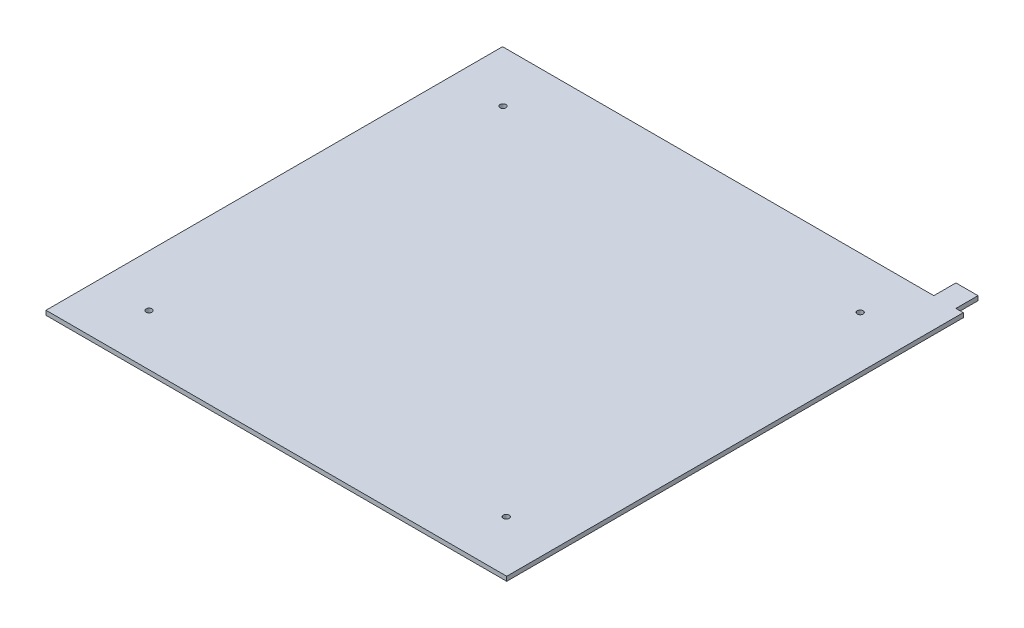
ISO-10303-21;
HEADER;
FILE_DESCRIPTION(('STEP AP214'),'2;1');
FILE_NAME('part.step','',(''),(''),'','','');
FILE_SCHEMA(('AUTOMOTIVE_DESIGN { 1 0 10303 214 1 1 1 1 }'));
ENDSEC;
DATA;
#1=APPLICATION_CONTEXT('core data for automotive mechanical design processes');
#2=APPLICATION_PROTOCOL_DEFINITION('international standard','automotive_design',2000,#1);
#3=PRODUCT_CONTEXT('',#1,'mechanical');
#4=PRODUCT('Part','Part','',(#3));
#5=PRODUCT_RELATED_PRODUCT_CATEGORY('part','',(#4));
#6=PRODUCT_DEFINITION_FORMATION('','',#4);
#7=PRODUCT_DEFINITION_CONTEXT('part definition',#1,'design');
#8=PRODUCT_DEFINITION('design','',#6,#7);
#9=PRODUCT_DEFINITION_SHAPE('','',#8);
#10=(LENGTH_UNIT() NAMED_UNIT(*) SI_UNIT(.MILLI.,.METRE.));
#11=(NAMED_UNIT(*) PLANE_ANGLE_UNIT() SI_UNIT($,.RADIAN.));
#12=(NAMED_UNIT(*) SI_UNIT($,.STERADIAN.) SOLID_ANGLE_UNIT());
#13=UNCERTAINTY_MEASURE_WITH_UNIT(LENGTH_MEASURE(1.E-05),#10,'distance_accuracy_value','');
#14=(GEOMETRIC_REPRESENTATION_CONTEXT(3) GLOBAL_UNCERTAINTY_ASSIGNED_CONTEXT((#13)) GLOBAL_UNIT_ASSIGNED_CONTEXT((#10,
#11,#12)) REPRESENTATION_CONTEXT('',''));
#15=CARTESIAN_POINT('',(0.,0.,0.));
#16=DIRECTION('',(0.,0.,1.));
#17=DIRECTION('',(1.,0.,0.));
#18=AXIS2_PLACEMENT_3D('',#15,#16,#17);
#19=CARTESIAN_POINT('',(0.,3.,0.));
#20=DIRECTION('',(0.,1.,0.));
#21=DIRECTION('',(0.,0.,1.));
#22=AXIS2_PLACEMENT_3D('',#19,#20,#21);
#23=PLANE('',#22);
#24=CARTESIAN_POINT('',(121.256330779657,3.,120.159391815663));
#25=DIRECTION('',(0.,1.,0.));
#26=DIRECTION('',(0.,0.,1.));
#27=AXIS2_PLACEMENT_3D('',#24,#25,#26);
#28=CIRCLE('',#27,2.);
#29=CARTESIAN_POINT('',(121.256330779657,3.,122.159391815663));
#30=VERTEX_POINT('',#29);
#31=EDGE_CURVE('E200',#30,#30,#28,.T.);
#32=ORIENTED_EDGE('',*,*,#31,.F.);
#33=EDGE_LOOP('',(#32));
#34=FACE_BOUND('',#33,.T.);
#35=CARTESIAN_POINT('',(-121.256330779657,3.,-120.159391815663));
#36=DIRECTION('',(0.,1.,0.));
#37=DIRECTION('',(0.,0.,1.));
#38=AXIS2_PLACEMENT_3D('',#35,#36,#37);
#39=CIRCLE('',#38,2.);
#40=CARTESIAN_POINT('',(-121.256330779657,3.,-118.159391815663));
#41=VERTEX_POINT('',#40);
#42=EDGE_CURVE('E146',#41,#41,#39,.T.);
#43=ORIENTED_EDGE('',*,*,#42,.F.);
#44=EDGE_LOOP('',(#43));
#45=FACE_BOUND('',#44,.T.);
#46=DIRECTION('',(-1.,0.,0.));
#47=VECTOR('',#46,1.);
#48=CARTESIAN_POINT('',(151.415,3.,-155.));
#49=LINE('',#48,#47);
#50=CARTESIAN_POINT('',(156.415,3.,-155.));
#51=VERTEX_POINT('',#50);
#52=CARTESIAN_POINT('',(151.415,3.,-155.));
#53=VERTEX_POINT('',#52);
#54=EDGE_CURVE('E157',#51,#53,#49,.T.);
#55=ORIENTED_EDGE('',*,*,#54,.T.);
#56=DIRECTION('',(0.,0.,-1.));
#57=VECTOR('',#56,1.);
#58=CARTESIAN_POINT('',(151.415,3.,-155.));
#59=LINE('',#58,#57);
#60=CARTESIAN_POINT('',(151.415,3.,-170.));
#61=VERTEX_POINT('',#60);
#62=EDGE_CURVE('E105',#53,#61,#59,.T.);
#63=ORIENTED_EDGE('',*,*,#62,.T.);
#64=DIRECTION('',(-1.,0.,0.));
#65=VECTOR('',#64,1.);
#66=CARTESIAN_POINT('',(151.415,3.,-170.));
#67=LINE('',#66,#65);
#68=CARTESIAN_POINT('',(136.415,3.,-170.));
#69=VERTEX_POINT('',#68);
#70=EDGE_CURVE('E172',#61,#69,#67,.T.);
#71=ORIENTED_EDGE('',*,*,#70,.T.);
#72=DIRECTION('',(0.,0.,1.));
#73=VECTOR('',#72,1.);
#74=CARTESIAN_POINT('',(136.415,3.,-170.));
#75=LINE('',#74,#73);
#76=CARTESIAN_POINT('',(136.415,3.,-155.));
#77=VERTEX_POINT('',#76);
#78=EDGE_CURVE('E185',#69,#77,#75,.T.);
#79=ORIENTED_EDGE('',*,*,#78,.T.);
#80=DIRECTION('',(-1.,0.,0.));
#81=VECTOR('',#80,1.);
#82=CARTESIAN_POINT('',(-156.415,3.,-155.));
#83=LINE('',#82,#81);
#84=CARTESIAN_POINT('',(-156.415,3.,-155.));
#85=VERTEX_POINT('',#84);
#86=EDGE_CURVE('E124',#77,#85,#83,.T.);
#87=ORIENTED_EDGE('',*,*,#86,.T.);
#88=DIRECTION('',(0.,0.,1.));
#89=VECTOR('',#88,1.);
#90=CARTESIAN_POINT('',(-156.415,3.,155.));
#91=LINE('',#90,#89);
#92=CARTESIAN_POINT('',(-156.415,3.,155.));
#93=VERTEX_POINT('',#92);
#94=EDGE_CURVE('E118',#85,#93,#91,.T.);
#95=ORIENTED_EDGE('',*,*,#94,.T.);
#96=DIRECTION('',(1.,0.,0.));
#97=VECTOR('',#96,1.);
#98=CARTESIAN_POINT('',(-156.415,3.,155.));
#99=LINE('',#98,#97);
#100=CARTESIAN_POINT('',(156.415,3.,155.));
#101=VERTEX_POINT('',#100);
#102=EDGE_CURVE('E122',#93,#101,#99,.T.);
#103=ORIENTED_EDGE('',*,*,#102,.T.);
#104=DIRECTION('',(0.,0.,-1.));
#105=VECTOR('',#104,1.);
#106=CARTESIAN_POINT('',(156.415,3.,155.));
#107=LINE('',#106,#105);
#108=EDGE_CURVE('E62',#101,#51,#107,.T.);
#109=ORIENTED_EDGE('',*,*,#108,.T.);
#110=EDGE_LOOP('',(#55,#63,#71,#79,#87,#95,#103,#109));
#111=FACE_BOUND('',#110,.T.);
#112=CARTESIAN_POINT('',(-121.256330779657,3.,120.159391815663));
#113=DIRECTION('',(0.,1.,0.));
#114=DIRECTION('',(0.,0.,-1.));
#115=AXIS2_PLACEMENT_3D('',#112,#113,#114);
#116=CIRCLE('',#115,2.);
#117=CARTESIAN_POINT('',(-121.256330779657,3.,118.159391815663));
#118=VERTEX_POINT('',#117);
#119=EDGE_CURVE('E194',#118,#118,#116,.T.);
#120=ORIENTED_EDGE('',*,*,#119,.F.);
#121=EDGE_LOOP('',(#120));
#122=FACE_BOUND('',#121,.T.);
#123=CARTESIAN_POINT('',(121.256330779657,3.,-120.159391815663));
#124=DIRECTION('',(0.,1.,0.));
#125=DIRECTION('',(0.,0.,-1.));
#126=AXIS2_PLACEMENT_3D('',#123,#124,#125);
#127=CIRCLE('',#126,2.);
#128=CARTESIAN_POINT('',(121.256330779657,3.,-122.159391815663));
#129=VERTEX_POINT('',#128);
#130=EDGE_CURVE('E206',#129,#129,#127,.T.);
#131=ORIENTED_EDGE('',*,*,#130,.F.);
#132=EDGE_LOOP('',(#131));
#133=FACE_BOUND('',#132,.T.);
#134=ADVANCED_FACE('F45',(#34,#45,#111,#122,#133),#23,.T.);
#135=CARTESIAN_POINT('',(0.,0.,0.));
#136=DIRECTION('',(0.,1.,0.));
#137=DIRECTION('',(0.,0.,1.));
#138=AXIS2_PLACEMENT_3D('',#135,#136,#137);
#139=PLANE('',#138);
#140=DIRECTION('',(-1.,0.,0.));
#141=VECTOR('',#140,1.);
#142=CARTESIAN_POINT('',(151.415,0.,-155.));
#143=LINE('',#142,#141);
#144=CARTESIAN_POINT('',(156.415,0.,-155.));
#145=VERTEX_POINT('',#144);
#146=CARTESIAN_POINT('',(151.415,0.,-155.));
#147=VERTEX_POINT('',#146);
#148=EDGE_CURVE('E142',#145,#147,#143,.T.);
#149=ORIENTED_EDGE('',*,*,#148,.F.);
#150=DIRECTION('',(0.,0.,-1.));
#151=VECTOR('',#150,1.);
#152=CARTESIAN_POINT('',(156.415,0.,155.));
#153=LINE('',#152,#151);
#154=CARTESIAN_POINT('',(156.415,0.,155.));
#155=VERTEX_POINT('',#154);
#156=EDGE_CURVE('E97',#155,#145,#153,.T.);
#157=ORIENTED_EDGE('',*,*,#156,.F.);
#158=DIRECTION('',(1.,0.,0.));
#159=VECTOR('',#158,1.);
#160=CARTESIAN_POINT('',(-156.415,0.,155.));
#161=LINE('',#160,#159);
#162=CARTESIAN_POINT('',(-156.415,0.,155.));
#163=VERTEX_POINT('',#162);
#164=EDGE_CURVE('E91',#163,#155,#161,.T.);
#165=ORIENTED_EDGE('',*,*,#164,.F.);
#166=DIRECTION('',(0.,0.,1.));
#167=VECTOR('',#166,1.);
#168=CARTESIAN_POINT('',(-156.415,0.,155.));
#169=LINE('',#168,#167);
#170=CARTESIAN_POINT('',(-156.415,0.,-155.));
#171=VERTEX_POINT('',#170);
#172=EDGE_CURVE('E132',#171,#163,#169,.T.);
#173=ORIENTED_EDGE('',*,*,#172,.F.);
#174=DIRECTION('',(-1.,0.,0.));
#175=VECTOR('',#174,1.);
#176=CARTESIAN_POINT('',(-156.415,0.,-155.));
#177=LINE('',#176,#175);
#178=CARTESIAN_POINT('',(136.415,0.,-155.));
#179=VERTEX_POINT('',#178);
#180=EDGE_CURVE('E152',#179,#171,#177,.T.);
#181=ORIENTED_EDGE('',*,*,#180,.F.);
#182=DIRECTION('',(0.,0.,1.));
#183=VECTOR('',#182,1.);
#184=CARTESIAN_POINT('',(136.415,0.,-170.));
#185=LINE('',#184,#183);
#186=CARTESIAN_POINT('',(136.415,0.,-170.));
#187=VERTEX_POINT('',#186);
#188=EDGE_CURVE('E150',#187,#179,#185,.T.);
#189=ORIENTED_EDGE('',*,*,#188,.F.);
#190=DIRECTION('',(-1.,0.,0.));
#191=VECTOR('',#190,1.);
#192=CARTESIAN_POINT('',(151.415,0.,-170.));
#193=LINE('',#192,#191);
#194=CARTESIAN_POINT('',(151.415,0.,-170.));
#195=VERTEX_POINT('',#194);
#196=EDGE_CURVE('E148',#195,#187,#193,.T.);
#197=ORIENTED_EDGE('',*,*,#196,.F.);
#198=DIRECTION('',(0.,0.,-1.));
#199=VECTOR('',#198,1.);
#200=CARTESIAN_POINT('',(151.415,0.,-155.));
#201=LINE('',#200,#199);
#202=EDGE_CURVE('E145',#147,#195,#201,.T.);
#203=ORIENTED_EDGE('',*,*,#202,.F.);
#204=EDGE_LOOP('',(#149,#157,#165,#173,#181,#189,#197,#203));
#205=FACE_BOUND('',#204,.T.);
#206=CARTESIAN_POINT('',(-121.256330779657,0.,-120.159391815663));
#207=DIRECTION('',(0.,1.,0.));
#208=DIRECTION('',(0.,0.,1.));
#209=AXIS2_PLACEMENT_3D('',#206,#207,#208);
#210=CIRCLE('',#209,2.);
#211=CARTESIAN_POINT('',(-121.256330779657,0.,-118.159391815663));
#212=VERTEX_POINT('',#211);
#213=EDGE_CURVE('E191',#212,#212,#210,.T.);
#214=ORIENTED_EDGE('',*,*,#213,.T.);
#215=EDGE_LOOP('',(#214));
#216=FACE_BOUND('',#215,.T.);
#217=CARTESIAN_POINT('',(-121.256330779657,0.,120.159391815663));
#218=DIRECTION('',(0.,1.,0.));
#219=DIRECTION('',(0.,0.,-1.));
#220=AXIS2_PLACEMENT_3D('',#217,#218,#219);
#221=CIRCLE('',#220,2.);
#222=CARTESIAN_POINT('',(-121.256330779657,0.,118.159391815663));
#223=VERTEX_POINT('',#222);
#224=EDGE_CURVE('E197',#223,#223,#221,.T.);
#225=ORIENTED_EDGE('',*,*,#224,.T.);
#226=EDGE_LOOP('',(#225));
#227=FACE_BOUND('',#226,.T.);
#228=CARTESIAN_POINT('',(121.256330779657,0.,120.159391815663));
#229=DIRECTION('',(0.,1.,0.));
#230=DIRECTION('',(0.,0.,1.));
#231=AXIS2_PLACEMENT_3D('',#228,#229,#230);
#232=CIRCLE('',#231,2.);
#233=CARTESIAN_POINT('',(121.256330779657,0.,122.159391815663));
#234=VERTEX_POINT('',#233);
#235=EDGE_CURVE('E203',#234,#234,#232,.T.);
#236=ORIENTED_EDGE('',*,*,#235,.T.);
#237=EDGE_LOOP('',(#236));
#238=FACE_BOUND('',#237,.T.);
#239=CARTESIAN_POINT('',(121.256330779657,0.,-120.159391815663));
#240=DIRECTION('',(0.,1.,0.));
#241=DIRECTION('',(0.,0.,-1.));
#242=AXIS2_PLACEMENT_3D('',#239,#240,#241);
#243=CIRCLE('',#242,2.);
#244=CARTESIAN_POINT('',(121.256330779657,0.,-122.159391815663));
#245=VERTEX_POINT('',#244);
#246=EDGE_CURVE('E209',#245,#245,#243,.T.);
#247=ORIENTED_EDGE('',*,*,#246,.T.);
#248=EDGE_LOOP('',(#247));
#249=FACE_BOUND('',#248,.T.);
#250=ADVANCED_FACE('F176',(#205,#216,#227,#238,#249),#139,.F.);
#251=CARTESIAN_POINT('',(151.415,3.,-155.));
#252=DIRECTION('',(0.,0.,1.));
#253=DIRECTION('',(1.,0.,0.));
#254=AXIS2_PLACEMENT_3D('',#251,#252,#253);
#255=PLANE('',#254);
#256=ORIENTED_EDGE('',*,*,#148,.T.);
#257=DIRECTION('',(0.,-1.,0.));
#258=VECTOR('',#257,1.);
#259=CARTESIAN_POINT('',(151.415,3.,-155.));
#260=LINE('',#259,#258);
#261=EDGE_CURVE('E11',#53,#147,#260,.T.);
#262=ORIENTED_EDGE('',*,*,#261,.F.);
#263=ORIENTED_EDGE('',*,*,#54,.F.);
#264=DIRECTION('',(0.,-1.,0.));
#265=VECTOR('',#264,1.);
#266=CARTESIAN_POINT('',(156.415,3.,-155.));
#267=LINE('',#266,#265);
#268=EDGE_CURVE('E138',#51,#145,#267,.T.);
#269=ORIENTED_EDGE('',*,*,#268,.T.);
#270=EDGE_LOOP('',(#256,#262,#263,#269));
#271=FACE_BOUND('',#270,.T.);
#272=ADVANCED_FACE('F47',(#271),#255,.F.);
#273=CARTESIAN_POINT('',(151.415,3.,-155.));
#274=DIRECTION('',(-1.,0.,0.));
#275=DIRECTION('',(0.,0.,1.));
#276=AXIS2_PLACEMENT_3D('',#273,#274,#275);
#277=PLANE('',#276);
#278=ORIENTED_EDGE('',*,*,#202,.T.);
#279=DIRECTION('',(0.,-1.,0.));
#280=VECTOR('',#279,1.);
#281=CARTESIAN_POINT('',(151.415,3.,-170.));
#282=LINE('',#281,#280);
#283=EDGE_CURVE('E54',#61,#195,#282,.T.);
#284=ORIENTED_EDGE('',*,*,#283,.F.);
#285=ORIENTED_EDGE('',*,*,#62,.F.);
#286=ORIENTED_EDGE('',*,*,#261,.T.);
#287=EDGE_LOOP('',(#278,#284,#285,#286));
#288=FACE_BOUND('',#287,.T.);
#289=ADVANCED_FACE('F243',(#288),#277,.F.);
#290=CARTESIAN_POINT('',(151.415,3.,-170.));
#291=DIRECTION('',(0.,0.,1.));
#292=DIRECTION('',(1.,0.,0.));
#293=AXIS2_PLACEMENT_3D('',#290,#291,#292);
#294=PLANE('',#293);
#295=ORIENTED_EDGE('',*,*,#196,.T.);
#296=DIRECTION('',(0.,-1.,0.));
#297=VECTOR('',#296,1.);
#298=CARTESIAN_POINT('',(136.415,3.,-170.));
#299=LINE('',#298,#297);
#300=EDGE_CURVE('E164',#69,#187,#299,.T.);
#301=ORIENTED_EDGE('',*,*,#300,.F.);
#302=ORIENTED_EDGE('',*,*,#70,.F.);
#303=ORIENTED_EDGE('',*,*,#283,.T.);
#304=EDGE_LOOP('',(#295,#301,#302,#303));
#305=FACE_BOUND('',#304,.T.);
#306=ADVANCED_FACE('F170',(#305),#294,.F.);
#307=CARTESIAN_POINT('',(136.415,3.,-170.));
#308=DIRECTION('',(1.,0.,0.));
#309=DIRECTION('',(0.,0.,-1.));
#310=AXIS2_PLACEMENT_3D('',#307,#308,#309);
#311=PLANE('',#310);
#312=ORIENTED_EDGE('',*,*,#188,.T.);
#313=DIRECTION('',(0.,-1.,0.));
#314=VECTOR('',#313,1.);
#315=CARTESIAN_POINT('',(136.415,3.,-155.));
#316=LINE('',#315,#314);
#317=EDGE_CURVE('E161',#77,#179,#316,.T.);
#318=ORIENTED_EDGE('',*,*,#317,.F.);
#319=ORIENTED_EDGE('',*,*,#78,.F.);
#320=ORIENTED_EDGE('',*,*,#300,.T.);
#321=EDGE_LOOP('',(#312,#318,#319,#320));
#322=FACE_BOUND('',#321,.T.);
#323=ADVANCED_FACE('F181',(#322),#311,.F.);
#324=CARTESIAN_POINT('',(-156.415,3.,-155.));
#325=DIRECTION('',(0.,0.,1.));
#326=DIRECTION('',(1.,0.,0.));
#327=AXIS2_PLACEMENT_3D('',#324,#325,#326);
#328=PLANE('',#327);
#329=ORIENTED_EDGE('',*,*,#180,.T.);
#330=DIRECTION('',(0.,-1.,0.));
#331=VECTOR('',#330,1.);
#332=CARTESIAN_POINT('',(-156.415,3.,-155.));
#333=LINE('',#332,#331);
#334=EDGE_CURVE('E133',#85,#171,#333,.T.);
#335=ORIENTED_EDGE('',*,*,#334,.F.);
#336=ORIENTED_EDGE('',*,*,#86,.F.);
#337=ORIENTED_EDGE('',*,*,#317,.T.);
#338=EDGE_LOOP('',(#329,#335,#336,#337));
#339=FACE_BOUND('',#338,.T.);
#340=ADVANCED_FACE('F184',(#339),#328,.F.);
#341=CARTESIAN_POINT('',(-156.415,3.,155.));
#342=DIRECTION('',(1.,0.,0.));
#343=DIRECTION('',(0.,0.,-1.));
#344=AXIS2_PLACEMENT_3D('',#341,#342,#343);
#345=PLANE('',#344);
#346=ORIENTED_EDGE('',*,*,#172,.T.);
#347=DIRECTION('',(0.,-1.,0.));
#348=VECTOR('',#347,1.);
#349=CARTESIAN_POINT('',(-156.415,3.,155.));
#350=LINE('',#349,#348);
#351=EDGE_CURVE('E129',#93,#163,#350,.T.);
#352=ORIENTED_EDGE('',*,*,#351,.F.);
#353=ORIENTED_EDGE('',*,*,#94,.F.);
#354=ORIENTED_EDGE('',*,*,#334,.T.);
#355=EDGE_LOOP('',(#346,#352,#353,#354));
#356=FACE_BOUND('',#355,.T.);
#357=ADVANCED_FACE('F130',(#356),#345,.F.);
#358=CARTESIAN_POINT('',(-156.415,3.,155.));
#359=DIRECTION('',(0.,0.,-1.));
#360=DIRECTION('',(-1.,0.,0.));
#361=AXIS2_PLACEMENT_3D('',#358,#359,#360);
#362=PLANE('',#361);
#363=ORIENTED_EDGE('',*,*,#164,.T.);
#364=DIRECTION('',(0.,-1.,0.));
#365=VECTOR('',#364,1.);
#366=CARTESIAN_POINT('',(156.415,3.,155.));
#367=LINE('',#366,#365);
#368=EDGE_CURVE('E134',#101,#155,#367,.T.);
#369=ORIENTED_EDGE('',*,*,#368,.F.);
#370=ORIENTED_EDGE('',*,*,#102,.F.);
#371=ORIENTED_EDGE('',*,*,#351,.T.);
#372=EDGE_LOOP('',(#363,#369,#370,#371));
#373=FACE_BOUND('',#372,.T.);
#374=ADVANCED_FACE('F136',(#373),#362,.F.);
#375=CARTESIAN_POINT('',(156.415,3.,155.));
#376=DIRECTION('',(-1.,0.,0.));
#377=DIRECTION('',(0.,0.,1.));
#378=AXIS2_PLACEMENT_3D('',#375,#376,#377);
#379=PLANE('',#378);
#380=ORIENTED_EDGE('',*,*,#156,.T.);
#381=ORIENTED_EDGE('',*,*,#268,.F.);
#382=ORIENTED_EDGE('',*,*,#108,.F.);
#383=ORIENTED_EDGE('',*,*,#368,.T.);
#384=EDGE_LOOP('',(#380,#381,#382,#383));
#385=FACE_BOUND('',#384,.T.);
#386=ADVANCED_FACE('F231',(#385),#379,.F.);
#387=CARTESIAN_POINT('',(-121.256330779657,3.,-120.159391815663));
#388=DIRECTION('',(0.,-1.,0.));
#389=DIRECTION('',(0.,0.,-1.));
#390=AXIS2_PLACEMENT_3D('',#387,#388,#389);
#391=CYLINDRICAL_SURFACE('',#390,2.);
#392=ORIENTED_EDGE('',*,*,#42,.T.);
#393=EDGE_LOOP('',(#392));
#394=FACE_BOUND('',#393,.T.);
#395=ORIENTED_EDGE('',*,*,#213,.F.);
#396=EDGE_LOOP('',(#395));
#397=FACE_BOUND('',#396,.T.);
#398=ADVANCED_FACE('F228',(#394,#397),#391,.F.);
#399=CARTESIAN_POINT('',(-121.256330779657,3.,120.159391815663));
#400=DIRECTION('',(0.,-1.,0.));
#401=DIRECTION('',(0.,0.,-1.));
#402=AXIS2_PLACEMENT_3D('',#399,#400,#401);
#403=CYLINDRICAL_SURFACE('',#402,2.);
#404=ORIENTED_EDGE('',*,*,#119,.T.);
#405=EDGE_LOOP('',(#404));
#406=FACE_BOUND('',#405,.T.);
#407=ORIENTED_EDGE('',*,*,#224,.F.);
#408=EDGE_LOOP('',(#407));
#409=FACE_BOUND('',#408,.T.);
#410=ADVANCED_FACE('F341',(#406,#409),#403,.F.);
#411=CARTESIAN_POINT('',(121.256330779657,3.,120.159391815663));
#412=DIRECTION('',(0.,-1.,0.));
#413=DIRECTION('',(0.,0.,-1.));
#414=AXIS2_PLACEMENT_3D('',#411,#412,#413);
#415=CYLINDRICAL_SURFACE('',#414,2.);
#416=ORIENTED_EDGE('',*,*,#31,.T.);
#417=EDGE_LOOP('',(#416));
#418=FACE_BOUND('',#417,.T.);
#419=ORIENTED_EDGE('',*,*,#235,.F.);
#420=EDGE_LOOP('',(#419));
#421=FACE_BOUND('',#420,.T.);
#422=ADVANCED_FACE('F352',(#418,#421),#415,.F.);
#423=CARTESIAN_POINT('',(121.256330779657,3.,-120.159391815663));
#424=DIRECTION('',(0.,-1.,0.));
#425=DIRECTION('',(0.,0.,-1.));
#426=AXIS2_PLACEMENT_3D('',#423,#424,#425);
#427=CYLINDRICAL_SURFACE('',#426,2.);
#428=ORIENTED_EDGE('',*,*,#130,.T.);
#429=EDGE_LOOP('',(#428));
#430=FACE_BOUND('',#429,.T.);
#431=ORIENTED_EDGE('',*,*,#246,.F.);
#432=EDGE_LOOP('',(#431));
#433=FACE_BOUND('',#432,.T.);
#434=ADVANCED_FACE('F215',(#430,#433),#427,.F.);
#435=CLOSED_SHELL('',(#134,#250,#272,#289,#306,#323,#340,#357,#374,#386,#398,#410,#422,#434));
#436=MANIFOLD_SOLID_BREP('B2',#435);
#437=ADVANCED_BREP_SHAPE_REPRESENTATION('',(#18,#436),#14);
#438=SHAPE_DEFINITION_REPRESENTATION(#9,#437);
ENDSEC;
END-ISO-10303-21;
